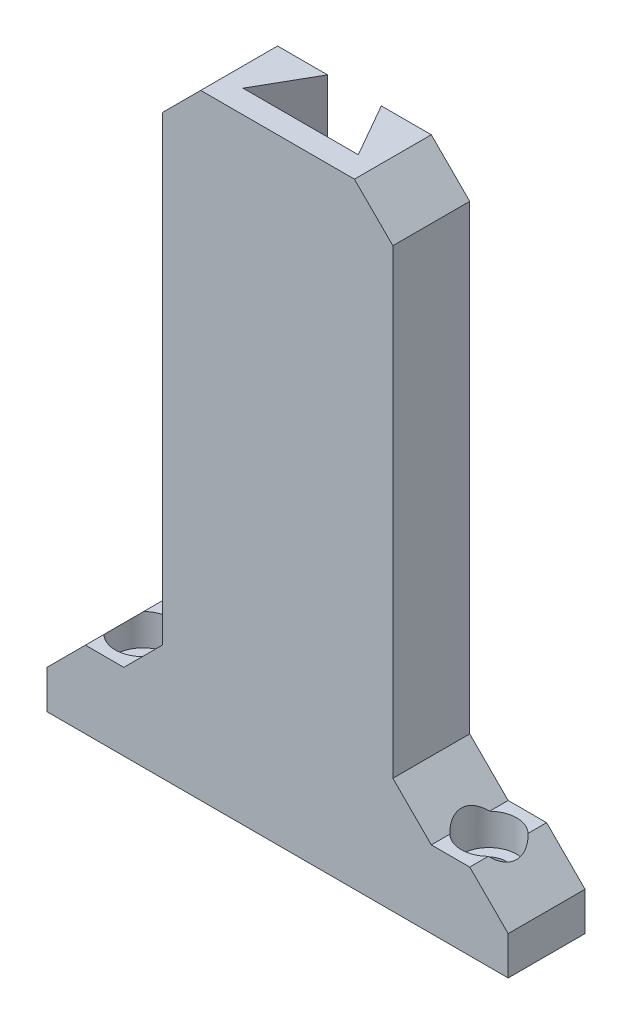
ISO-10303-21;
HEADER;
FILE_DESCRIPTION(('STEP AP214'),'2;1');
FILE_NAME('part.step','',(''),(''),'','','');
FILE_SCHEMA(('AUTOMOTIVE_DESIGN { 1 0 10303 214 1 1 1 1 }'));
ENDSEC;
DATA;
#1=APPLICATION_CONTEXT('core data for automotive mechanical design processes');
#2=APPLICATION_PROTOCOL_DEFINITION('international standard','automotive_design',2000,#1);
#3=PRODUCT_CONTEXT('',#1,'mechanical');
#4=PRODUCT('Part','Part','',(#3));
#5=PRODUCT_RELATED_PRODUCT_CATEGORY('part','',(#4));
#6=PRODUCT_DEFINITION_FORMATION('','',#4);
#7=PRODUCT_DEFINITION_CONTEXT('part definition',#1,'design');
#8=PRODUCT_DEFINITION('design','',#6,#7);
#9=PRODUCT_DEFINITION_SHAPE('','',#8);
#10=(LENGTH_UNIT() NAMED_UNIT(*) SI_UNIT(.MILLI.,.METRE.));
#11=(NAMED_UNIT(*) PLANE_ANGLE_UNIT() SI_UNIT($,.RADIAN.));
#12=(NAMED_UNIT(*) SI_UNIT($,.STERADIAN.) SOLID_ANGLE_UNIT());
#13=UNCERTAINTY_MEASURE_WITH_UNIT(LENGTH_MEASURE(1.E-05),#10,'distance_accuracy_value','');
#14=(GEOMETRIC_REPRESENTATION_CONTEXT(3) GLOBAL_UNCERTAINTY_ASSIGNED_CONTEXT((#13)) GLOBAL_UNIT_ASSIGNED_CONTEXT((#10,
#11,#12)) REPRESENTATION_CONTEXT('',''));
#15=CARTESIAN_POINT('',(0.,0.,0.));
#16=DIRECTION('',(0.,0.,1.));
#17=DIRECTION('',(1.,0.,0.));
#18=AXIS2_PLACEMENT_3D('',#15,#16,#17);
#19=CARTESIAN_POINT('',(0.,5.,10.));
#20=DIRECTION('',(0.,-1.,0.));
#21=DIRECTION('',(1.,0.,0.));
#22=AXIS2_PLACEMENT_3D('',#19,#20,#21);
#23=PLANE('',#22);
#24=CARTESIAN_POINT('',(-22.5,5.,5.));
#25=DIRECTION('',(0.,-1.,0.));
#26=DIRECTION('',(1.,0.,0.));
#27=AXIS2_PLACEMENT_3D('',#24,#25,#26);
#28=CIRCLE('',#27,3.6);
#29=CARTESIAN_POINT('',(-20.,5.,2.4096332306023));
#30=VERTEX_POINT('',#29);
#31=CARTESIAN_POINT('',(-25.,5.,2.40963323060224));
#32=VERTEX_POINT('',#31);
#33=EDGE_CURVE('E317',#30,#32,#28,.F.);
#34=ORIENTED_EDGE('',*,*,#33,.F.);
#35=DIRECTION('',(0.,0.,-1.));
#36=VECTOR('',#35,1.);
#37=CARTESIAN_POINT('',(-20.,5.,10.));
#38=LINE('',#37,#36);
#39=CARTESIAN_POINT('',(-20.,5.,0.));
#40=VERTEX_POINT('',#39);
#41=EDGE_CURVE('E328',#30,#40,#38,.T.);
#42=ORIENTED_EDGE('',*,*,#41,.T.);
#43=DIRECTION('',(-1.,0.,0.));
#44=VECTOR('',#43,1.);
#45=CARTESIAN_POINT('',(0.,5.,0.));
#46=LINE('',#45,#44);
#47=CARTESIAN_POINT('',(-25.,5.,0.));
#48=VERTEX_POINT('',#47);
#49=EDGE_CURVE('E395',#40,#48,#46,.T.);
#50=ORIENTED_EDGE('',*,*,#49,.T.);
#51=DIRECTION('',(0.,0.,1.));
#52=VECTOR('',#51,1.);
#53=CARTESIAN_POINT('',(-25.,5.,10.));
#54=LINE('',#53,#52);
#55=EDGE_CURVE('E229',#48,#32,#54,.T.);
#56=ORIENTED_EDGE('',*,*,#55,.T.);
#57=EDGE_LOOP('',(#34,#42,#50,#56));
#58=FACE_BOUND('',#57,.T.);
#59=ADVANCED_FACE('F47',(#58),#23,.F.);
#60=CARTESIAN_POINT('',(0.,5.,10.));
#61=DIRECTION('',(0.,-1.,0.));
#62=DIRECTION('',(1.,0.,0.));
#63=AXIS2_PLACEMENT_3D('',#60,#61,#62);
#64=PLANE('',#63);
#65=CARTESIAN_POINT('',(22.5,5.,5.));
#66=DIRECTION('',(0.,-1.,0.));
#67=DIRECTION('',(1.,0.,0.));
#68=AXIS2_PLACEMENT_3D('',#65,#66,#67);
#69=CIRCLE('',#68,3.6);
#70=CARTESIAN_POINT('',(25.,5.,2.40963323060224));
#71=VERTEX_POINT('',#70);
#72=CARTESIAN_POINT('',(20.,5.,2.40963323060229));
#73=VERTEX_POINT('',#72);
#74=EDGE_CURVE('E73',#71,#73,#69,.F.);
#75=ORIENTED_EDGE('',*,*,#74,.F.);
#76=DIRECTION('',(0.,0.,-1.));
#77=VECTOR('',#76,1.);
#78=CARTESIAN_POINT('',(25.,5.,0.));
#79=LINE('',#78,#77);
#80=CARTESIAN_POINT('',(25.,5.,0.));
#81=VERTEX_POINT('',#80);
#82=EDGE_CURVE('E234',#71,#81,#79,.T.);
#83=ORIENTED_EDGE('',*,*,#82,.T.);
#84=DIRECTION('',(-1.,0.,0.));
#85=VECTOR('',#84,1.);
#86=CARTESIAN_POINT('',(0.,5.,0.));
#87=LINE('',#86,#85);
#88=CARTESIAN_POINT('',(20.,5.,0.));
#89=VERTEX_POINT('',#88);
#90=EDGE_CURVE('E380',#81,#89,#87,.T.);
#91=ORIENTED_EDGE('',*,*,#90,.T.);
#92=DIRECTION('',(0.,0.,1.));
#93=VECTOR('',#92,1.);
#94=CARTESIAN_POINT('',(20.,5.,10.));
#95=LINE('',#94,#93);
#96=EDGE_CURVE('E228',#89,#73,#95,.T.);
#97=ORIENTED_EDGE('',*,*,#96,.T.);
#98=EDGE_LOOP('',(#75,#83,#91,#97));
#99=FACE_BOUND('',#98,.T.);
#100=ADVANCED_FACE('F276',(#99),#64,.F.);
#101=CARTESIAN_POINT('',(22.5,-208.,5.));
#102=DIRECTION('',(0.,1.,0.));
#103=DIRECTION('',(-1.,0.,0.));
#104=AXIS2_PLACEMENT_3D('',#101,#102,#103);
#105=CYLINDRICAL_SURFACE('',#104,2.1);
#106=CARTESIAN_POINT('',(22.5,-5.,5.));
#107=DIRECTION('',(0.,-1.,0.));
#108=DIRECTION('',(1.,0.,0.));
#109=AXIS2_PLACEMENT_3D('',#106,#107,#108);
#110=CIRCLE('',#109,2.1);
#111=CARTESIAN_POINT('',(24.6,-5.,5.));
#112=VERTEX_POINT('',#111);
#113=EDGE_CURVE('E261',#112,#112,#110,.T.);
#114=ORIENTED_EDGE('',*,*,#113,.T.);
#115=EDGE_LOOP('',(#114));
#116=FACE_BOUND('',#115,.T.);
#117=CARTESIAN_POINT('',(22.5,0.900000000000012,5.));
#118=DIRECTION('',(0.,1.,0.));
#119=DIRECTION('',(-1.,0.,0.));
#120=AXIS2_PLACEMENT_3D('',#117,#118,#119);
#121=CIRCLE('',#120,2.1);
#122=CARTESIAN_POINT('',(20.4,0.900000000000012,5.));
#123=VERTEX_POINT('',#122);
#124=EDGE_CURVE('E222',#123,#123,#121,.F.);
#125=ORIENTED_EDGE('',*,*,#124,.F.);
#126=EDGE_LOOP('',(#125));
#127=FACE_BOUND('',#126,.T.);
#128=ADVANCED_FACE('F273',(#116,#127),#105,.F.);
#129=CARTESIAN_POINT('',(0.,0.,0.));
#130=DIRECTION('',(0.,0.,1.));
#131=DIRECTION('',(1.,0.,0.));
#132=AXIS2_PLACEMENT_3D('',#129,#130,#131);
#133=PLANE('',#132);
#134=DIRECTION('',(-1.,0.,0.));
#135=VECTOR('',#134,1.);
#136=CARTESIAN_POINT('',(0.,-5.,0.));
#137=LINE('',#136,#135);
#138=CARTESIAN_POINT('',(30.,-4.99999999999999,0.));
#139=VERTEX_POINT('',#138);
#140=CARTESIAN_POINT('',(3.5,-5.,0.));
#141=VERTEX_POINT('',#140);
#142=EDGE_CURVE('E387',#139,#141,#137,.T.);
#143=ORIENTED_EDGE('',*,*,#142,.T.);
#144=DIRECTION('',(0.,1.,0.));
#145=VECTOR('',#144,1.);
#146=CARTESIAN_POINT('',(3.5,0.,0.));
#147=LINE('',#146,#145);
#148=CARTESIAN_POINT('',(3.5,75.,0.));
#149=VERTEX_POINT('',#148);
#150=EDGE_CURVE('E212',#141,#149,#147,.T.);
#151=ORIENTED_EDGE('',*,*,#150,.T.);
#152=DIRECTION('',(1.,0.,0.));
#153=VECTOR('',#152,1.);
#154=CARTESIAN_POINT('',(0.,75.,0.));
#155=LINE('',#154,#153);
#156=CARTESIAN_POINT('',(9.99999999999997,75.,0.));
#157=VERTEX_POINT('',#156);
#158=EDGE_CURVE('E376',#149,#157,#155,.T.);
#159=ORIENTED_EDGE('',*,*,#158,.T.);
#160=DIRECTION('',(0.707106781186548,-0.707106781186548,0.));
#161=VECTOR('',#160,1.);
#162=CARTESIAN_POINT('',(9.99999999999997,75.,0.));
#163=LINE('',#162,#161);
#164=CARTESIAN_POINT('',(15.,70.,0.));
#165=VERTEX_POINT('',#164);
#166=EDGE_CURVE('E351',#157,#165,#163,.T.);
#167=ORIENTED_EDGE('',*,*,#166,.T.);
#168=DIRECTION('',(0.,1.,0.));
#169=VECTOR('',#168,1.);
#170=CARTESIAN_POINT('',(15.,0.,0.));
#171=LINE('',#170,#169);
#172=CARTESIAN_POINT('',(15.,9.99999999999997,0.));
#173=VERTEX_POINT('',#172);
#174=EDGE_CURVE('E377',#173,#165,#171,.T.);
#175=ORIENTED_EDGE('',*,*,#174,.F.);
#176=DIRECTION('',(-0.707106781186552,0.707106781186543,0.));
#177=VECTOR('',#176,1.);
#178=CARTESIAN_POINT('',(12.4999999999999,12.5,0.));
#179=LINE('',#178,#177);
#180=EDGE_CURVE('E248',#173,#89,#179,.F.);
#181=ORIENTED_EDGE('',*,*,#180,.T.);
#182=ORIENTED_EDGE('',*,*,#90,.F.);
#183=DIRECTION('',(0.707106781186548,-0.707106781186548,0.));
#184=VECTOR('',#183,1.);
#185=CARTESIAN_POINT('',(25.,5.,0.));
#186=LINE('',#185,#184);
#187=CARTESIAN_POINT('',(30.,0.,0.));
#188=VERTEX_POINT('',#187);
#189=EDGE_CURVE('E357',#81,#188,#186,.T.);
#190=ORIENTED_EDGE('',*,*,#189,.T.);
#191=DIRECTION('',(0.,-1.,0.));
#192=VECTOR('',#191,1.);
#193=CARTESIAN_POINT('',(30.,0.,0.));
#194=LINE('',#193,#192);
#195=EDGE_CURVE('E384',#188,#139,#194,.T.);
#196=ORIENTED_EDGE('',*,*,#195,.T.);
#197=EDGE_LOOP('',(#143,#151,#159,#167,#175,#181,#182,#190,#196));
#198=FACE_BOUND('',#197,.T.);
#199=ADVANCED_FACE('F275',(#198),#133,.F.);
#200=CARTESIAN_POINT('',(-15.,0.,10.));
#201=DIRECTION('',(-1.,0.,0.));
#202=DIRECTION('',(0.,0.,1.));
#203=AXIS2_PLACEMENT_3D('',#200,#201,#202);
#204=PLANE('',#203);
#205=DIRECTION('',(0.,1.,0.));
#206=VECTOR('',#205,1.);
#207=CARTESIAN_POINT('',(-15.,0.,10.));
#208=LINE('',#207,#206);
#209=CARTESIAN_POINT('',(-15.,10.,10.));
#210=VERTEX_POINT('',#209);
#211=CARTESIAN_POINT('',(-15.,70.,10.));
#212=VERTEX_POINT('',#211);
#213=EDGE_CURVE('E375',#210,#212,#208,.T.);
#214=ORIENTED_EDGE('',*,*,#213,.T.);
#215=DIRECTION('',(0.,0.,-1.));
#216=VECTOR('',#215,1.);
#217=CARTESIAN_POINT('',(-15.,70.,10.));
#218=LINE('',#217,#216);
#219=CARTESIAN_POINT('',(-15.,70.,0.));
#220=VERTEX_POINT('',#219);
#221=EDGE_CURVE('E333',#212,#220,#218,.T.);
#222=ORIENTED_EDGE('',*,*,#221,.T.);
#223=DIRECTION('',(0.,1.,0.));
#224=VECTOR('',#223,1.);
#225=CARTESIAN_POINT('',(-15.,0.,0.));
#226=LINE('',#225,#224);
#227=CARTESIAN_POINT('',(-15.,10.,0.));
#228=VERTEX_POINT('',#227);
#229=EDGE_CURVE('E398',#228,#220,#226,.T.);
#230=ORIENTED_EDGE('',*,*,#229,.F.);
#231=DIRECTION('',(0.,0.,1.));
#232=VECTOR('',#231,1.);
#233=CARTESIAN_POINT('',(-15.,10.,10.));
#234=LINE('',#233,#232);
#235=EDGE_CURVE('E336',#228,#210,#234,.T.);
#236=ORIENTED_EDGE('',*,*,#235,.T.);
#237=EDGE_LOOP('',(#214,#222,#230,#236));
#238=FACE_BOUND('',#237,.T.);
#239=ADVANCED_FACE('F283',(#238),#204,.T.);
#240=CARTESIAN_POINT('',(-25.,5.,7.59036676939775));
#241=VERTEX_POINT('',#240);
#242=CARTESIAN_POINT('',(-20.,5.,7.59036676939771));
#243=VERTEX_POINT('',#242);
#244=EDGE_CURVE('E62',#241,#243,#28,.F.);
#245=ORIENTED_EDGE('',*,*,#244,.F.);
#246=CARTESIAN_POINT('',(-25.,5.,10.));
#247=VERTEX_POINT('',#246);
#248=EDGE_CURVE('E236',#241,#247,#54,.T.);
#249=ORIENTED_EDGE('',*,*,#248,.T.);
#250=DIRECTION('',(-1.,0.,0.));
#251=VECTOR('',#250,1.);
#252=CARTESIAN_POINT('',(0.,5.,10.));
#253=LINE('',#252,#251);
#254=CARTESIAN_POINT('',(-20.,5.,10.));
#255=VERTEX_POINT('',#254);
#256=EDGE_CURVE('E418',#255,#247,#253,.T.);
#257=ORIENTED_EDGE('',*,*,#256,.F.);
#258=EDGE_CURVE('E316',#255,#243,#38,.T.);
#259=ORIENTED_EDGE('',*,*,#258,.T.);
#260=EDGE_LOOP('',(#245,#249,#257,#259));
#261=FACE_BOUND('',#260,.T.);
#262=ADVANCED_FACE('F295',(#261),#23,.F.);
#263=CARTESIAN_POINT('',(-30.,0.,10.));
#264=DIRECTION('',(1.,0.,0.));
#265=DIRECTION('',(0.,0.,-1.));
#266=AXIS2_PLACEMENT_3D('',#263,#264,#265);
#267=PLANE('',#266);
#268=DIRECTION('',(0.,-1.,0.));
#269=VECTOR('',#268,1.);
#270=CARTESIAN_POINT('',(-30.,0.,10.));
#271=LINE('',#270,#269);
#272=CARTESIAN_POINT('',(-30.,0.,10.));
#273=VERTEX_POINT('',#272);
#274=CARTESIAN_POINT('',(-30.,-5.,10.));
#275=VERTEX_POINT('',#274);
#276=EDGE_CURVE('E416',#273,#275,#271,.T.);
#277=ORIENTED_EDGE('',*,*,#276,.F.);
#278=DIRECTION('',(0.,0.,-1.));
#279=VECTOR('',#278,1.);
#280=CARTESIAN_POINT('',(-30.,0.,10.));
#281=LINE('',#280,#279);
#282=CARTESIAN_POINT('',(-30.,0.,0.));
#283=VERTEX_POINT('',#282);
#284=EDGE_CURVE('E329',#273,#283,#281,.T.);
#285=ORIENTED_EDGE('',*,*,#284,.T.);
#286=DIRECTION('',(0.,-1.,0.));
#287=VECTOR('',#286,1.);
#288=CARTESIAN_POINT('',(-30.,0.,0.));
#289=LINE('',#288,#287);
#290=CARTESIAN_POINT('',(-30.,-5.,0.));
#291=VERTEX_POINT('',#290);
#292=EDGE_CURVE('E392',#283,#291,#289,.T.);
#293=ORIENTED_EDGE('',*,*,#292,.T.);
#294=DIRECTION('',(0.,0.,-1.));
#295=VECTOR('',#294,1.);
#296=CARTESIAN_POINT('',(-30.,-5.,10.));
#297=LINE('',#296,#295);
#298=EDGE_CURVE('E364',#275,#291,#297,.T.);
#299=ORIENTED_EDGE('',*,*,#298,.F.);
#300=EDGE_LOOP('',(#277,#285,#293,#299));
#301=FACE_BOUND('',#300,.T.);
#302=ADVANCED_FACE('F302',(#301),#267,.F.);
#303=CARTESIAN_POINT('',(0.,-5.,10.));
#304=DIRECTION('',(0.,-1.,0.));
#305=DIRECTION('',(1.,0.,0.));
#306=AXIS2_PLACEMENT_3D('',#303,#304,#305);
#307=PLANE('',#306);
#308=ORIENTED_EDGE('',*,*,#113,.F.);
#309=EDGE_LOOP('',(#308));
#310=FACE_BOUND('',#309,.T.);
#311=CARTESIAN_POINT('',(-22.5,-5.,5.));
#312=DIRECTION('',(0.,-1.,0.));
#313=DIRECTION('',(1.,0.,0.));
#314=AXIS2_PLACEMENT_3D('',#311,#312,#313);
#315=CIRCLE('',#314,2.1);
#316=CARTESIAN_POINT('',(-20.4,-5.,5.));
#317=VERTEX_POINT('',#316);
#318=EDGE_CURVE('E257',#317,#317,#315,.T.);
#319=ORIENTED_EDGE('',*,*,#318,.F.);
#320=EDGE_LOOP('',(#319));
#321=FACE_BOUND('',#320,.T.);
#322=DIRECTION('',(0.496161372900181,0.,0.868230322000912));
#323=VECTOR('',#322,1.);
#324=CARTESIAN_POINT('',(6.94620710772172,-5.,6.03050070046669));
#325=LINE('',#324,#323);
#326=CARTESIAN_POINT('',(7.50023993897972,-5.,7.));
#327=VERTEX_POINT('',#326);
#328=EDGE_CURVE('E423',#141,#327,#325,.T.);
#329=ORIENTED_EDGE('',*,*,#328,.F.);
#330=ORIENTED_EDGE('',*,*,#142,.F.);
#331=DIRECTION('',(0.,0.,-1.));
#332=VECTOR('',#331,1.);
#333=CARTESIAN_POINT('',(30.,-4.99999999999999,10.));
#334=LINE('',#333,#332);
#335=CARTESIAN_POINT('',(30.,-4.99999999999999,10.));
#336=VERTEX_POINT('',#335);
#337=EDGE_CURVE('E367',#336,#139,#334,.T.);
#338=ORIENTED_EDGE('',*,*,#337,.F.);
#339=DIRECTION('',(-1.,0.,0.));
#340=VECTOR('',#339,1.);
#341=CARTESIAN_POINT('',(0.,-5.,10.));
#342=LINE('',#341,#340);
#343=EDGE_CURVE('E412',#336,#275,#342,.T.);
#344=ORIENTED_EDGE('',*,*,#343,.T.);
#345=ORIENTED_EDGE('',*,*,#298,.T.);
#346=CARTESIAN_POINT('',(-3.5,-5.,0.));
#347=VERTEX_POINT('',#346);
#348=EDGE_CURVE('E391',#347,#291,#137,.T.);
#349=ORIENTED_EDGE('',*,*,#348,.F.);
#350=DIRECTION('',(0.496161372900181,0.,-0.868230322000912));
#351=VECTOR('',#350,1.);
#352=CARTESIAN_POINT('',(-6.94620710772171,-5.,6.03050070046668));
#353=LINE('',#352,#351);
#354=CARTESIAN_POINT('',(-7.50023993897972,-5.,7.));
#355=VERTEX_POINT('',#354);
#356=EDGE_CURVE('E425',#355,#347,#353,.T.);
#357=ORIENTED_EDGE('',*,*,#356,.F.);
#358=DIRECTION('',(-1.,0.,0.));
#359=VECTOR('',#358,1.);
#360=CARTESIAN_POINT('',(0.,-5.,7.));
#361=LINE('',#360,#359);
#362=EDGE_CURVE('E401',#327,#355,#361,.T.);
#363=ORIENTED_EDGE('',*,*,#362,.F.);
#364=EDGE_LOOP('',(#329,#330,#338,#344,#345,#349,#357,#363));
#365=FACE_BOUND('',#364,.T.);
#366=ADVANCED_FACE('F308',(#310,#321,#365),#307,.T.);
#367=CARTESIAN_POINT('',(30.,0.,10.));
#368=DIRECTION('',(1.,0.,0.));
#369=DIRECTION('',(0.,0.,-1.));
#370=AXIS2_PLACEMENT_3D('',#367,#368,#369);
#371=PLANE('',#370);
#372=ORIENTED_EDGE('',*,*,#195,.F.);
#373=DIRECTION('',(0.,0.,1.));
#374=VECTOR('',#373,1.);
#375=CARTESIAN_POINT('',(30.,0.,10.));
#376=LINE('',#375,#374);
#377=CARTESIAN_POINT('',(30.,0.,10.));
#378=VERTEX_POINT('',#377);
#379=EDGE_CURVE('E241',#188,#378,#376,.T.);
#380=ORIENTED_EDGE('',*,*,#379,.T.);
#381=DIRECTION('',(0.,-1.,0.));
#382=VECTOR('',#381,1.);
#383=CARTESIAN_POINT('',(30.,0.,10.));
#384=LINE('',#383,#382);
#385=EDGE_CURVE('E410',#378,#336,#384,.T.);
#386=ORIENTED_EDGE('',*,*,#385,.T.);
#387=ORIENTED_EDGE('',*,*,#337,.T.);
#388=EDGE_LOOP('',(#372,#380,#386,#387));
#389=FACE_BOUND('',#388,.T.);
#390=ADVANCED_FACE('F476',(#389),#371,.T.);
#391=CARTESIAN_POINT('',(20.,5.,7.59036676939771));
#392=VERTEX_POINT('',#391);
#393=CARTESIAN_POINT('',(25.,5.,7.59036676939775));
#394=VERTEX_POINT('',#393);
#395=EDGE_CURVE('E205',#392,#394,#69,.F.);
#396=ORIENTED_EDGE('',*,*,#395,.F.);
#397=CARTESIAN_POINT('',(20.,5.,10.));
#398=VERTEX_POINT('',#397);
#399=EDGE_CURVE('E217',#392,#398,#95,.T.);
#400=ORIENTED_EDGE('',*,*,#399,.T.);
#401=DIRECTION('',(-1.,0.,0.));
#402=VECTOR('',#401,1.);
#403=CARTESIAN_POINT('',(0.,5.,10.));
#404=LINE('',#403,#402);
#405=CARTESIAN_POINT('',(25.,5.,10.));
#406=VERTEX_POINT('',#405);
#407=EDGE_CURVE('E407',#406,#398,#404,.T.);
#408=ORIENTED_EDGE('',*,*,#407,.F.);
#409=EDGE_CURVE('E220',#406,#394,#79,.T.);
#410=ORIENTED_EDGE('',*,*,#409,.T.);
#411=EDGE_LOOP('',(#396,#400,#408,#410));
#412=FACE_BOUND('',#411,.T.);
#413=ADVANCED_FACE('F215',(#412),#64,.F.);
#414=CARTESIAN_POINT('',(15.,0.,10.));
#415=DIRECTION('',(-1.,0.,0.));
#416=DIRECTION('',(0.,0.,1.));
#417=AXIS2_PLACEMENT_3D('',#414,#415,#416);
#418=PLANE('',#417);
#419=ORIENTED_EDGE('',*,*,#174,.T.);
#420=DIRECTION('',(0.,0.,1.));
#421=VECTOR('',#420,1.);
#422=CARTESIAN_POINT('',(15.,70.,10.));
#423=LINE('',#422,#421);
#424=CARTESIAN_POINT('',(15.,70.,10.));
#425=VERTEX_POINT('',#424);
#426=EDGE_CURVE('E346',#165,#425,#423,.T.);
#427=ORIENTED_EDGE('',*,*,#426,.T.);
#428=DIRECTION('',(0.,1.,0.));
#429=VECTOR('',#428,1.);
#430=CARTESIAN_POINT('',(15.,0.,10.));
#431=LINE('',#430,#429);
#432=CARTESIAN_POINT('',(15.,9.99999999999997,10.));
#433=VERTEX_POINT('',#432);
#434=EDGE_CURVE('E404',#433,#425,#431,.T.);
#435=ORIENTED_EDGE('',*,*,#434,.F.);
#436=DIRECTION('',(0.,0.,-1.));
#437=VECTOR('',#436,1.);
#438=CARTESIAN_POINT('',(15.,9.99999999999997,0.));
#439=LINE('',#438,#437);
#440=EDGE_CURVE('E348',#433,#173,#439,.T.);
#441=ORIENTED_EDGE('',*,*,#440,.T.);
#442=EDGE_LOOP('',(#419,#427,#435,#441));
#443=FACE_BOUND('',#442,.T.);
#444=ADVANCED_FACE('F530',(#443),#418,.F.);
#445=CARTESIAN_POINT('',(0.,75.,10.));
#446=DIRECTION('',(0.,1.,0.));
#447=DIRECTION('',(0.,0.,1.));
#448=AXIS2_PLACEMENT_3D('',#445,#446,#447);
#449=PLANE('',#448);
#450=DIRECTION('',(-0.496161372900181,0.,-0.868230322000912));
#451=VECTOR('',#450,1.);
#452=CARTESIAN_POINT('',(3.5,75.,0.));
#453=LINE('',#452,#451);
#454=CARTESIAN_POINT('',(7.50023993897972,75.,7.));
#455=VERTEX_POINT('',#454);
#456=EDGE_CURVE('E260',#455,#149,#453,.T.);
#457=ORIENTED_EDGE('',*,*,#456,.F.);
#458=DIRECTION('',(1.,0.,0.));
#459=VECTOR('',#458,1.);
#460=CARTESIAN_POINT('',(7.50023993897972,75.,7.));
#461=LINE('',#460,#459);
#462=CARTESIAN_POINT('',(-7.50023993897972,75.,7.));
#463=VERTEX_POINT('',#462);
#464=EDGE_CURVE('E430',#463,#455,#461,.T.);
#465=ORIENTED_EDGE('',*,*,#464,.F.);
#466=DIRECTION('',(-0.496161372900181,0.,0.868230322000912));
#467=VECTOR('',#466,1.);
#468=CARTESIAN_POINT('',(-7.50023993897972,75.,7.));
#469=LINE('',#468,#467);
#470=CARTESIAN_POINT('',(-3.5,75.,0.));
#471=VERTEX_POINT('',#470);
#472=EDGE_CURVE('E434',#471,#463,#469,.T.);
#473=ORIENTED_EDGE('',*,*,#472,.F.);
#474=CARTESIAN_POINT('',(-9.99999999999999,75.,0.));
#475=VERTEX_POINT('',#474);
#476=EDGE_CURVE('E372',#475,#471,#155,.T.);
#477=ORIENTED_EDGE('',*,*,#476,.F.);
#478=DIRECTION('',(0.,0.,1.));
#479=VECTOR('',#478,1.);
#480=CARTESIAN_POINT('',(-9.99999999999999,75.,10.));
#481=LINE('',#480,#479);
#482=CARTESIAN_POINT('',(-9.99999999999999,75.,10.));
#483=VERTEX_POINT('',#482);
#484=EDGE_CURVE('E362',#475,#483,#481,.T.);
#485=ORIENTED_EDGE('',*,*,#484,.T.);
#486=DIRECTION('',(1.,0.,0.));
#487=VECTOR('',#486,1.);
#488=CARTESIAN_POINT('',(0.,75.,10.));
#489=LINE('',#488,#487);
#490=CARTESIAN_POINT('',(9.99999999999997,75.,10.));
#491=VERTEX_POINT('',#490);
#492=EDGE_CURVE('E371',#483,#491,#489,.T.);
#493=ORIENTED_EDGE('',*,*,#492,.T.);
#494=DIRECTION('',(0.,0.,-1.));
#495=VECTOR('',#494,1.);
#496=CARTESIAN_POINT('',(9.99999999999997,75.,0.));
#497=LINE('',#496,#495);
#498=EDGE_CURVE('E359',#491,#157,#497,.T.);
#499=ORIENTED_EDGE('',*,*,#498,.T.);
#500=ORIENTED_EDGE('',*,*,#158,.F.);
#501=EDGE_LOOP('',(#457,#465,#473,#477,#485,#493,#499,#500));
#502=FACE_BOUND('',#501,.T.);
#503=ADVANCED_FACE('F509',(#502),#449,.T.);
#504=CARTESIAN_POINT('',(0.,0.,10.));
#505=DIRECTION('',(0.,0.,1.));
#506=DIRECTION('',(1.,0.,0.));
#507=AXIS2_PLACEMENT_3D('',#504,#505,#506);
#508=PLANE('',#507);
#509=ORIENTED_EDGE('',*,*,#434,.T.);
#510=DIRECTION('',(-0.707106781186548,0.707106781186548,0.));
#511=VECTOR('',#510,1.);
#512=CARTESIAN_POINT('',(42.5,42.5,10.));
#513=LINE('',#512,#511);
#514=EDGE_CURVE('E338',#425,#491,#513,.T.);
#515=ORIENTED_EDGE('',*,*,#514,.T.);
#516=ORIENTED_EDGE('',*,*,#492,.F.);
#517=DIRECTION('',(0.707106781186546,0.707106781186549,0.));
#518=VECTOR('',#517,1.);
#519=CARTESIAN_POINT('',(-42.5,42.4999999999998,10.));
#520=LINE('',#519,#518);
#521=EDGE_CURVE('E340',#483,#212,#520,.F.);
#522=ORIENTED_EDGE('',*,*,#521,.T.);
#523=ORIENTED_EDGE('',*,*,#213,.F.);
#524=DIRECTION('',(-0.707106781186545,-0.70710678118655,0.));
#525=VECTOR('',#524,1.);
#526=CARTESIAN_POINT('',(-20.,5.,10.));
#527=LINE('',#526,#525);
#528=EDGE_CURVE('E246',#210,#255,#527,.T.);
#529=ORIENTED_EDGE('',*,*,#528,.T.);
#530=ORIENTED_EDGE('',*,*,#256,.T.);
#531=DIRECTION('',(0.707106781186546,0.707106781186549,0.));
#532=VECTOR('',#531,1.);
#533=CARTESIAN_POINT('',(-15.0000000000001,15.,10.));
#534=LINE('',#533,#532);
#535=EDGE_CURVE('E327',#247,#273,#534,.F.);
#536=ORIENTED_EDGE('',*,*,#535,.T.);
#537=ORIENTED_EDGE('',*,*,#276,.T.);
#538=ORIENTED_EDGE('',*,*,#343,.F.);
#539=ORIENTED_EDGE('',*,*,#385,.F.);
#540=DIRECTION('',(-0.707106781186548,0.707106781186548,0.));
#541=VECTOR('',#540,1.);
#542=CARTESIAN_POINT('',(15.,15.,10.));
#543=LINE('',#542,#541);
#544=EDGE_CURVE('E343',#378,#406,#543,.T.);
#545=ORIENTED_EDGE('',*,*,#544,.T.);
#546=ORIENTED_EDGE('',*,*,#407,.T.);
#547=DIRECTION('',(0.707106781186552,-0.707106781186543,0.));
#548=VECTOR('',#547,1.);
#549=CARTESIAN_POINT('',(15.,9.99999999999997,10.));
#550=LINE('',#549,#548);
#551=EDGE_CURVE('E226',#398,#433,#550,.F.);
#552=ORIENTED_EDGE('',*,*,#551,.T.);
#553=EDGE_LOOP('',(#509,#515,#516,#522,#523,#529,#530,#536,#537,#538,#539,#545,#546,#552));
#554=FACE_BOUND('',#553,.T.);
#555=ADVANCED_FACE('F495',(#554),#508,.T.);
#556=ORIENTED_EDGE('',*,*,#476,.T.);
#557=DIRECTION('',(0.,-1.,0.));
#558=VECTOR('',#557,1.);
#559=CARTESIAN_POINT('',(-3.5,0.,0.));
#560=LINE('',#559,#558);
#561=EDGE_CURVE('E252',#471,#347,#560,.T.);
#562=ORIENTED_EDGE('',*,*,#561,.T.);
#563=ORIENTED_EDGE('',*,*,#348,.T.);
#564=ORIENTED_EDGE('',*,*,#292,.F.);
#565=DIRECTION('',(-0.707106781186546,-0.707106781186549,0.));
#566=VECTOR('',#565,1.);
#567=CARTESIAN_POINT('',(-30.,0.,0.));
#568=LINE('',#567,#566);
#569=EDGE_CURVE('E355',#283,#48,#568,.F.);
#570=ORIENTED_EDGE('',*,*,#569,.T.);
#571=ORIENTED_EDGE('',*,*,#49,.F.);
#572=DIRECTION('',(0.707106781186545,0.70710678118655,0.));
#573=VECTOR('',#572,1.);
#574=CARTESIAN_POINT('',(-12.5000000000001,12.5,0.));
#575=LINE('',#574,#573);
#576=EDGE_CURVE('E244',#40,#228,#575,.T.);
#577=ORIENTED_EDGE('',*,*,#576,.T.);
#578=ORIENTED_EDGE('',*,*,#229,.T.);
#579=DIRECTION('',(-0.707106781186546,-0.707106781186549,0.));
#580=VECTOR('',#579,1.);
#581=CARTESIAN_POINT('',(-15.,70.,0.));
#582=LINE('',#581,#580);
#583=EDGE_CURVE('E353',#220,#475,#582,.F.);
#584=ORIENTED_EDGE('',*,*,#583,.T.);
#585=EDGE_LOOP('',(#556,#562,#563,#564,#570,#571,#577,#578,#584));
#586=FACE_BOUND('',#585,.T.);
#587=ADVANCED_FACE('F286',(#586),#133,.F.);
#588=CARTESIAN_POINT('',(9.99999999999997,75.,10.));
#589=DIRECTION('',(0.707106781186547,0.707106781186547,0.));
#590=DIRECTION('',(0.,0.,1.));
#591=AXIS2_PLACEMENT_3D('',#588,#589,#590);
#592=PLANE('',#591);
#593=ORIENTED_EDGE('',*,*,#514,.F.);
#594=ORIENTED_EDGE('',*,*,#426,.F.);
#595=ORIENTED_EDGE('',*,*,#166,.F.);
#596=ORIENTED_EDGE('',*,*,#498,.F.);
#597=EDGE_LOOP('',(#593,#594,#595,#596));
#598=FACE_BOUND('',#597,.T.);
#599=ADVANCED_FACE('F527',(#598),#592,.T.);
#600=CARTESIAN_POINT('',(-15.,70.,10.));
#601=DIRECTION('',(0.707106781186549,-0.707106781186545,0.));
#602=DIRECTION('',(0.,0.,-1.));
#603=AXIS2_PLACEMENT_3D('',#600,#601,#602);
#604=PLANE('',#603);
#605=ORIENTED_EDGE('',*,*,#521,.F.);
#606=ORIENTED_EDGE('',*,*,#484,.F.);
#607=ORIENTED_EDGE('',*,*,#583,.F.);
#608=ORIENTED_EDGE('',*,*,#221,.F.);
#609=EDGE_LOOP('',(#605,#606,#607,#608));
#610=FACE_BOUND('',#609,.T.);
#611=ADVANCED_FACE('F569',(#610),#604,.F.);
#612=CARTESIAN_POINT('',(-30.,0.,10.));
#613=DIRECTION('',(0.707106781186549,-0.707106781186545,0.));
#614=DIRECTION('',(0.,0.,-1.));
#615=AXIS2_PLACEMENT_3D('',#612,#613,#614);
#616=PLANE('',#615);
#617=ORIENTED_EDGE('',*,*,#248,.F.);
#618=CARTESIAN_POINT('',(-22.5,7.50000000000001,5.));
#619=DIRECTION('',(0.707106781186549,-0.707106781186545,0.));
#620=DIRECTION('',(-0.707106781186546,-0.707106781186549,0.));
#621=AXIS2_PLACEMENT_3D('',#618,#619,#620);
#622=ELLIPSE('',#621,5.09116882454315,3.6);
#623=EDGE_CURVE('E325',#241,#32,#622,.T.);
#624=ORIENTED_EDGE('',*,*,#623,.T.);
#625=ORIENTED_EDGE('',*,*,#55,.F.);
#626=ORIENTED_EDGE('',*,*,#569,.F.);
#627=ORIENTED_EDGE('',*,*,#284,.F.);
#628=ORIENTED_EDGE('',*,*,#535,.F.);
#629=EDGE_LOOP('',(#617,#624,#625,#626,#627,#628));
#630=FACE_BOUND('',#629,.T.);
#631=ADVANCED_FACE('F323',(#630),#616,.F.);
#632=CARTESIAN_POINT('',(-20.,5.,10.));
#633=DIRECTION('',(0.707106781186551,-0.707106781186545,0.));
#634=DIRECTION('',(0.,0.,-1.));
#635=AXIS2_PLACEMENT_3D('',#632,#633,#634);
#636=PLANE('',#635);
#637=CARTESIAN_POINT('',(-22.5,2.49999999999997,5.));
#638=DIRECTION('',(0.707106781186551,-0.707106781186545,0.));
#639=DIRECTION('',(-0.707106781186545,-0.70710678118655,0.));
#640=AXIS2_PLACEMENT_3D('',#637,#638,#639);
#641=ELLIPSE('',#640,5.09116882454316,3.6);
#642=EDGE_CURVE('E11',#243,#30,#641,.F.);
#643=ORIENTED_EDGE('',*,*,#642,.F.);
#644=ORIENTED_EDGE('',*,*,#258,.F.);
#645=ORIENTED_EDGE('',*,*,#528,.F.);
#646=ORIENTED_EDGE('',*,*,#235,.F.);
#647=ORIENTED_EDGE('',*,*,#576,.F.);
#648=ORIENTED_EDGE('',*,*,#41,.F.);
#649=EDGE_LOOP('',(#643,#644,#645,#646,#647,#648));
#650=FACE_BOUND('',#649,.T.);
#651=ADVANCED_FACE('F583',(#650),#636,.F.);
#652=CARTESIAN_POINT('',(25.,5.,10.));
#653=DIRECTION('',(0.707106781186547,0.707106781186547,0.));
#654=DIRECTION('',(0.,0.,1.));
#655=AXIS2_PLACEMENT_3D('',#652,#653,#654);
#656=PLANE('',#655);
#657=ORIENTED_EDGE('',*,*,#82,.F.);
#658=CARTESIAN_POINT('',(22.5,7.49999999999995,5.));
#659=DIRECTION('',(0.707106781186547,0.707106781186547,0.));
#660=DIRECTION('',(0.707106781186548,-0.707106781186548,0.));
#661=AXIS2_PLACEMENT_3D('',#658,#659,#660);
#662=ELLIPSE('',#661,5.09116882454314,3.6);
#663=EDGE_CURVE('E318',#71,#394,#662,.F.);
#664=ORIENTED_EDGE('',*,*,#663,.T.);
#665=ORIENTED_EDGE('',*,*,#409,.F.);
#666=ORIENTED_EDGE('',*,*,#544,.F.);
#667=ORIENTED_EDGE('',*,*,#379,.F.);
#668=ORIENTED_EDGE('',*,*,#189,.F.);
#669=EDGE_LOOP('',(#657,#664,#665,#666,#667,#668));
#670=FACE_BOUND('',#669,.T.);
#671=ADVANCED_FACE('F521',(#670),#656,.T.);
#672=CARTESIAN_POINT('',(15.,9.99999999999997,10.));
#673=DIRECTION('',(0.707106781186543,0.707106781186552,0.));
#674=DIRECTION('',(0.,0.,1.));
#675=AXIS2_PLACEMENT_3D('',#672,#673,#674);
#676=PLANE('',#675);
#677=CARTESIAN_POINT('',(22.5,2.5,5.));
#678=DIRECTION('',(0.707106781186543,0.707106781186552,0.));
#679=DIRECTION('',(0.707106781186552,-0.707106781186543,0.));
#680=AXIS2_PLACEMENT_3D('',#677,#678,#679);
#681=ELLIPSE('',#680,5.09116882454311,3.6);
#682=EDGE_CURVE('E56',#73,#392,#681,.T.);
#683=ORIENTED_EDGE('',*,*,#682,.F.);
#684=ORIENTED_EDGE('',*,*,#96,.F.);
#685=ORIENTED_EDGE('',*,*,#180,.F.);
#686=ORIENTED_EDGE('',*,*,#440,.F.);
#687=ORIENTED_EDGE('',*,*,#551,.F.);
#688=ORIENTED_EDGE('',*,*,#399,.F.);
#689=EDGE_LOOP('',(#683,#684,#685,#686,#687,#688));
#690=FACE_BOUND('',#689,.T.);
#691=ADVANCED_FACE('F50',(#690),#676,.T.);
#692=CARTESIAN_POINT('',(3.5,-138.,0.));
#693=DIRECTION('',(0.868230322000912,0.,-0.496161372900181));
#694=DIRECTION('',(-0.496161372900181,0.,-0.868230322000912));
#695=AXIS2_PLACEMENT_3D('',#692,#693,#694);
#696=PLANE('',#695);
#697=ORIENTED_EDGE('',*,*,#328,.T.);
#698=DIRECTION('',(0.,1.,0.));
#699=VECTOR('',#698,1.);
#700=CARTESIAN_POINT('',(7.50023993897972,-138.,7.));
#701=LINE('',#700,#699);
#702=EDGE_CURVE('E427',#327,#455,#701,.T.);
#703=ORIENTED_EDGE('',*,*,#702,.T.);
#704=ORIENTED_EDGE('',*,*,#456,.T.);
#705=ORIENTED_EDGE('',*,*,#150,.F.);
#706=EDGE_LOOP('',(#697,#703,#704,#705));
#707=FACE_BOUND('',#706,.T.);
#708=ADVANCED_FACE('F513',(#707),#696,.F.);
#709=CARTESIAN_POINT('',(7.50023993897972,-138.,7.));
#710=DIRECTION('',(0.,0.,1.));
#711=DIRECTION('',(1.,0.,0.));
#712=AXIS2_PLACEMENT_3D('',#709,#710,#711);
#713=PLANE('',#712);
#714=ORIENTED_EDGE('',*,*,#362,.T.);
#715=DIRECTION('',(0.,1.,0.));
#716=VECTOR('',#715,1.);
#717=CARTESIAN_POINT('',(-7.50023993897972,-138.,7.));
#718=LINE('',#717,#716);
#719=EDGE_CURVE('E428',#355,#463,#718,.T.);
#720=ORIENTED_EDGE('',*,*,#719,.T.);
#721=ORIENTED_EDGE('',*,*,#464,.T.);
#722=ORIENTED_EDGE('',*,*,#702,.F.);
#723=EDGE_LOOP('',(#714,#720,#721,#722));
#724=FACE_BOUND('',#723,.T.);
#725=ADVANCED_FACE('F512',(#724),#713,.F.);
#726=CARTESIAN_POINT('',(-7.50023993897972,-138.,7.));
#727=DIRECTION('',(-0.868230322000912,0.,-0.496161372900181));
#728=DIRECTION('',(-0.496161372900181,0.,0.868230322000912));
#729=AXIS2_PLACEMENT_3D('',#726,#727,#728);
#730=PLANE('',#729);
#731=ORIENTED_EDGE('',*,*,#356,.T.);
#732=ORIENTED_EDGE('',*,*,#561,.F.);
#733=ORIENTED_EDGE('',*,*,#472,.T.);
#734=ORIENTED_EDGE('',*,*,#719,.F.);
#735=EDGE_LOOP('',(#731,#732,#733,#734));
#736=FACE_BOUND('',#735,.T.);
#737=ADVANCED_FACE('F466',(#736),#730,.F.);
#738=CARTESIAN_POINT('',(-22.5,-208.,5.));
#739=DIRECTION('',(0.,1.,0.));
#740=DIRECTION('',(-1.,0.,0.));
#741=AXIS2_PLACEMENT_3D('',#738,#739,#740);
#742=CYLINDRICAL_SURFACE('',#741,2.1);
#743=CARTESIAN_POINT('',(-22.5,0.900000000000012,5.));
#744=DIRECTION('',(0.,-1.,0.));
#745=DIRECTION('',(1.,0.,0.));
#746=AXIS2_PLACEMENT_3D('',#743,#744,#745);
#747=CIRCLE('',#746,2.1);
#748=CARTESIAN_POINT('',(-20.4,0.900000000000012,5.));
#749=VERTEX_POINT('',#748);
#750=EDGE_CURVE('E262',#749,#749,#747,.F.);
#751=ORIENTED_EDGE('',*,*,#750,.T.);
#752=EDGE_LOOP('',(#751));
#753=FACE_BOUND('',#752,.T.);
#754=ORIENTED_EDGE('',*,*,#318,.T.);
#755=EDGE_LOOP('',(#754));
#756=FACE_BOUND('',#755,.T.);
#757=ADVANCED_FACE('F461',(#753,#756),#742,.F.);
#758=CARTESIAN_POINT('',(-22.5,0.9,5.));
#759=DIRECTION('',(0.,-1.,0.));
#760=DIRECTION('',(1.,0.,0.));
#761=AXIS2_PLACEMENT_3D('',#758,#759,#760);
#762=PLANE('',#761);
#763=CARTESIAN_POINT('',(-22.5,0.9,5.));
#764=DIRECTION('',(0.,1.,0.));
#765=DIRECTION('',(1.,0.,0.));
#766=AXIS2_PLACEMENT_3D('',#763,#764,#765);
#767=CIRCLE('',#766,3.6);
#768=CARTESIAN_POINT('',(-18.9,0.9,5.));
#769=VERTEX_POINT('',#768);
#770=EDGE_CURVE('E443',#769,#769,#767,.T.);
#771=ORIENTED_EDGE('',*,*,#770,.T.);
#772=EDGE_LOOP('',(#771));
#773=FACE_BOUND('',#772,.T.);
#774=ORIENTED_EDGE('',*,*,#750,.F.);
#775=EDGE_LOOP('',(#774));
#776=FACE_BOUND('',#775,.T.);
#777=ADVANCED_FACE('F459',(#773,#776),#762,.F.);
#778=CARTESIAN_POINT('',(-22.5,218.,5.));
#779=DIRECTION('',(0.,-1.,0.));
#780=DIRECTION('',(1.,0.,0.));
#781=AXIS2_PLACEMENT_3D('',#778,#779,#780);
#782=CYLINDRICAL_SURFACE('',#781,3.6);
#783=ORIENTED_EDGE('',*,*,#244,.T.);
#784=ORIENTED_EDGE('',*,*,#642,.T.);
#785=ORIENTED_EDGE('',*,*,#33,.T.);
#786=ORIENTED_EDGE('',*,*,#623,.F.);
#787=EDGE_LOOP('',(#783,#784,#785,#786));
#788=FACE_BOUND('',#787,.T.);
#789=ORIENTED_EDGE('',*,*,#770,.F.);
#790=EDGE_LOOP('',(#789));
#791=FACE_BOUND('',#790,.T.);
#792=ADVANCED_FACE('F455',(#788,#791),#782,.F.);
#793=CARTESIAN_POINT('',(22.5,0.900000000000005,5.));
#794=DIRECTION('',(0.,1.,0.));
#795=DIRECTION('',(-1.,0.,0.));
#796=AXIS2_PLACEMENT_3D('',#793,#794,#795);
#797=PLANE('',#796);
#798=CARTESIAN_POINT('',(22.5,0.900000000000005,5.));
#799=DIRECTION('',(0.,1.,0.));
#800=DIRECTION('',(-1.,0.,0.));
#801=AXIS2_PLACEMENT_3D('',#798,#799,#800);
#802=CIRCLE('',#801,3.6);
#803=CARTESIAN_POINT('',(18.9,0.900000000000005,5.));
#804=VERTEX_POINT('',#803);
#805=EDGE_CURVE('E265',#804,#804,#802,.T.);
#806=ORIENTED_EDGE('',*,*,#805,.T.);
#807=EDGE_LOOP('',(#806));
#808=FACE_BOUND('',#807,.T.);
#809=ORIENTED_EDGE('',*,*,#124,.T.);
#810=EDGE_LOOP('',(#809));
#811=FACE_BOUND('',#810,.T.);
#812=ADVANCED_FACE('F271',(#808,#811),#797,.T.);
#813=CARTESIAN_POINT('',(22.5,218.,5.));
#814=DIRECTION('',(0.,-1.,0.));
#815=DIRECTION('',(1.,0.,0.));
#816=AXIS2_PLACEMENT_3D('',#813,#814,#815);
#817=CYLINDRICAL_SURFACE('',#816,3.6);
#818=ORIENTED_EDGE('',*,*,#74,.T.);
#819=ORIENTED_EDGE('',*,*,#682,.T.);
#820=ORIENTED_EDGE('',*,*,#395,.T.);
#821=ORIENTED_EDGE('',*,*,#663,.F.);
#822=EDGE_LOOP('',(#818,#819,#820,#821));
#823=FACE_BOUND('',#822,.T.);
#824=ORIENTED_EDGE('',*,*,#805,.F.);
#825=EDGE_LOOP('',(#824));
#826=FACE_BOUND('',#825,.T.);
#827=ADVANCED_FACE('F203',(#823,#826),#817,.F.);
#828=CLOSED_SHELL('',(#59,#100,#128,#199,#239,#262,#302,#366,#390,#413,#444,#503,#555,#587,#599,
#611,#631,#651,#671,#691,#708,#725,#737,#757,#777,#792,#812,#827));
#829=MANIFOLD_SOLID_BREP('B2',#828);
#830=ADVANCED_BREP_SHAPE_REPRESENTATION('',(#18,#829),#14);
#831=SHAPE_DEFINITION_REPRESENTATION(#9,#830);
ENDSEC;
END-ISO-10303-21;
